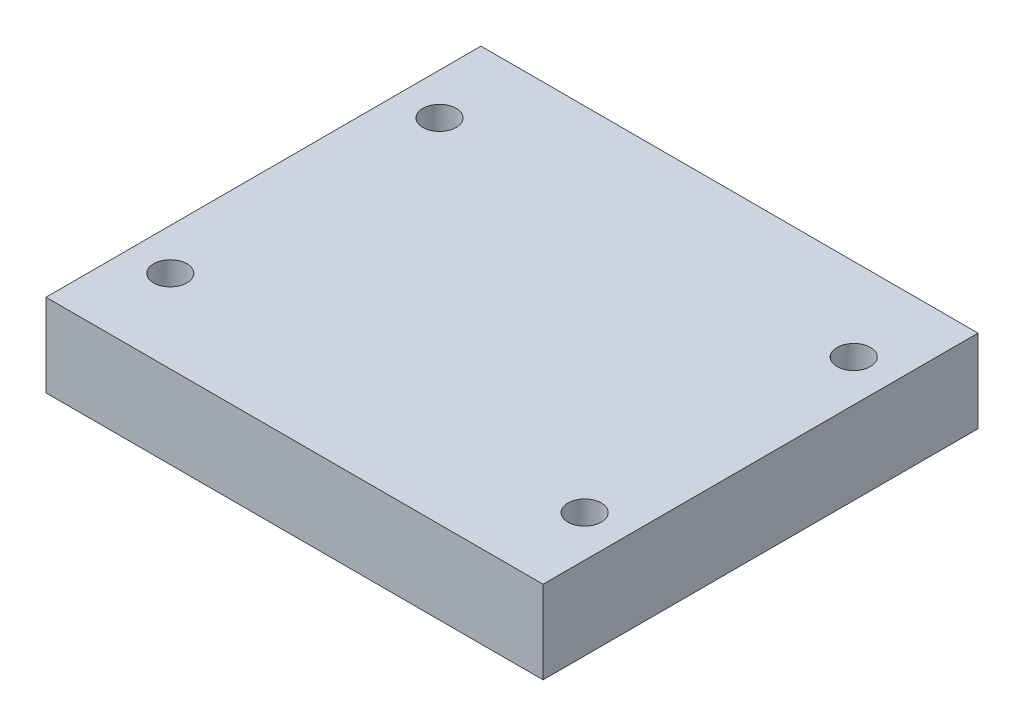
ISO-10303-21;
HEADER;
FILE_DESCRIPTION(('STEP AP214'),'2;1');
FILE_NAME('part.step','',(''),(''),'','','');
FILE_SCHEMA(('AUTOMOTIVE_DESIGN { 1 0 10303 214 1 1 1 1 }'));
ENDSEC;
DATA;
#1=APPLICATION_CONTEXT('core data for automotive mechanical design processes');
#2=APPLICATION_PROTOCOL_DEFINITION('international standard','automotive_design',2000,#1);
#3=PRODUCT_CONTEXT('',#1,'mechanical');
#4=PRODUCT('Part','Part','',(#3));
#5=PRODUCT_RELATED_PRODUCT_CATEGORY('part','',(#4));
#6=PRODUCT_DEFINITION_FORMATION('','',#4);
#7=PRODUCT_DEFINITION_CONTEXT('part definition',#1,'design');
#8=PRODUCT_DEFINITION('design','',#6,#7);
#9=PRODUCT_DEFINITION_SHAPE('','',#8);
#10=(LENGTH_UNIT() NAMED_UNIT(*) SI_UNIT(.MILLI.,.METRE.));
#11=(NAMED_UNIT(*) PLANE_ANGLE_UNIT() SI_UNIT($,.RADIAN.));
#12=(NAMED_UNIT(*) SI_UNIT($,.STERADIAN.) SOLID_ANGLE_UNIT());
#13=UNCERTAINTY_MEASURE_WITH_UNIT(LENGTH_MEASURE(1.E-05),#10,'distance_accuracy_value','');
#14=(GEOMETRIC_REPRESENTATION_CONTEXT(3) GLOBAL_UNCERTAINTY_ASSIGNED_CONTEXT((#13)) GLOBAL_UNIT_ASSIGNED_CONTEXT((#10,
#11,#12)) REPRESENTATION_CONTEXT('',''));
#15=CARTESIAN_POINT('',(0.,0.,0.));
#16=DIRECTION('',(0.,0.,1.));
#17=DIRECTION('',(1.,0.,0.));
#18=AXIS2_PLACEMENT_3D('',#15,#16,#17);
#19=CARTESIAN_POINT('',(0.,0.,0.));
#20=DIRECTION('',(0.,-1.,0.));
#21=DIRECTION('',(0.,0.,-1.));
#22=AXIS2_PLACEMENT_3D('',#19,#20,#21);
#23=PLANE('',#22);
#24=DIRECTION('',(0.,0.,1.));
#25=VECTOR('',#24,1.);
#26=CARTESIAN_POINT('',(-38.1,0.,33.3375));
#27=LINE('',#26,#25);
#28=CARTESIAN_POINT('',(-38.1,0.,-33.3375));
#29=VERTEX_POINT('',#28);
#30=CARTESIAN_POINT('',(-38.1,0.,33.3375));
#31=VERTEX_POINT('',#30);
#32=EDGE_CURVE('E97',#29,#31,#27,.T.);
#33=ORIENTED_EDGE('',*,*,#32,.F.);
#34=DIRECTION('',(-1.,0.,0.));
#35=VECTOR('',#34,1.);
#36=CARTESIAN_POINT('',(-38.1,0.,-33.3375));
#37=LINE('',#36,#35);
#38=CARTESIAN_POINT('',(38.1,0.,-33.3375));
#39=VERTEX_POINT('',#38);
#40=EDGE_CURVE('E73',#39,#29,#37,.T.);
#41=ORIENTED_EDGE('',*,*,#40,.F.);
#42=DIRECTION('',(0.,0.,-1.));
#43=VECTOR('',#42,1.);
#44=CARTESIAN_POINT('',(38.1,0.,33.3375));
#45=LINE('',#44,#43);
#46=CARTESIAN_POINT('',(38.1,0.,33.3375));
#47=VERTEX_POINT('',#46);
#48=EDGE_CURVE('E67',#47,#39,#45,.T.);
#49=ORIENTED_EDGE('',*,*,#48,.F.);
#50=DIRECTION('',(1.,0.,0.));
#51=VECTOR('',#50,1.);
#52=CARTESIAN_POINT('',(-38.1,0.,33.3375));
#53=LINE('',#52,#51);
#54=EDGE_CURVE('E89',#31,#47,#53,.T.);
#55=ORIENTED_EDGE('',*,*,#54,.F.);
#56=EDGE_LOOP('',(#33,#41,#49,#55));
#57=FACE_BOUND('',#56,.T.);
#58=CARTESIAN_POINT('',(31.7748107462907,0.,20.6375));
#59=DIRECTION('',(0.,1.,0.));
#60=DIRECTION('',(0.,0.,1.));
#61=AXIS2_PLACEMENT_3D('',#58,#59,#60);
#62=CIRCLE('',#61,2.5527);
#63=CARTESIAN_POINT('',(31.7748107462907,0.,23.1902));
#64=VERTEX_POINT('',#63);
#65=EDGE_CURVE('E100',#64,#64,#62,.T.);
#66=ORIENTED_EDGE('',*,*,#65,.T.);
#67=EDGE_LOOP('',(#66));
#68=FACE_BOUND('',#67,.T.);
#69=CARTESIAN_POINT('',(31.75,0.,-20.6375));
#70=DIRECTION('',(0.,1.,0.));
#71=DIRECTION('',(0.,0.,1.));
#72=AXIS2_PLACEMENT_3D('',#69,#70,#71);
#73=CIRCLE('',#72,2.5527);
#74=CARTESIAN_POINT('',(31.75,0.,-18.0848));
#75=VERTEX_POINT('',#74);
#76=EDGE_CURVE('E116',#75,#75,#73,.T.);
#77=ORIENTED_EDGE('',*,*,#76,.T.);
#78=EDGE_LOOP('',(#77));
#79=FACE_BOUND('',#78,.T.);
#80=CARTESIAN_POINT('',(-31.75,0.,20.6375));
#81=DIRECTION('',(0.,1.,0.));
#82=DIRECTION('',(0.,0.,1.));
#83=AXIS2_PLACEMENT_3D('',#80,#81,#82);
#84=CIRCLE('',#83,2.5527);
#85=CARTESIAN_POINT('',(-31.75,0.,23.1902));
#86=VERTEX_POINT('',#85);
#87=EDGE_CURVE('E122',#86,#86,#84,.T.);
#88=ORIENTED_EDGE('',*,*,#87,.T.);
#89=EDGE_LOOP('',(#88));
#90=FACE_BOUND('',#89,.T.);
#91=CARTESIAN_POINT('',(-31.75,0.,-20.6375));
#92=DIRECTION('',(0.,1.,0.));
#93=DIRECTION('',(0.,0.,1.));
#94=AXIS2_PLACEMENT_3D('',#91,#92,#93);
#95=CIRCLE('',#94,2.5527);
#96=CARTESIAN_POINT('',(-31.75,0.,-18.0848));
#97=VERTEX_POINT('',#96);
#98=EDGE_CURVE('E128',#97,#97,#95,.T.);
#99=ORIENTED_EDGE('',*,*,#98,.T.);
#100=EDGE_LOOP('',(#99));
#101=FACE_BOUND('',#100,.T.);
#102=ADVANCED_FACE('F33',(#57,#68,#79,#90,#101),#23,.T.);
#103=CARTESIAN_POINT('',(-38.1,12.7,33.3375));
#104=DIRECTION('',(1.,0.,0.));
#105=DIRECTION('',(0.,0.,-1.));
#106=AXIS2_PLACEMENT_3D('',#103,#104,#105);
#107=PLANE('',#106);
#108=ORIENTED_EDGE('',*,*,#32,.T.);
#109=DIRECTION('',(0.,-1.,0.));
#110=VECTOR('',#109,1.);
#111=CARTESIAN_POINT('',(-38.1,12.7,33.3375));
#112=LINE('',#111,#110);
#113=CARTESIAN_POINT('',(-38.1,12.7,33.3375));
#114=VERTEX_POINT('',#113);
#115=EDGE_CURVE('E11',#114,#31,#112,.T.);
#116=ORIENTED_EDGE('',*,*,#115,.F.);
#117=DIRECTION('',(0.,0.,1.));
#118=VECTOR('',#117,1.);
#119=CARTESIAN_POINT('',(-38.1,12.7,33.3375));
#120=LINE('',#119,#118);
#121=CARTESIAN_POINT('',(-38.1,12.7,-33.3375));
#122=VERTEX_POINT('',#121);
#123=EDGE_CURVE('E85',#122,#114,#120,.T.);
#124=ORIENTED_EDGE('',*,*,#123,.F.);
#125=DIRECTION('',(0.,-1.,0.));
#126=VECTOR('',#125,1.);
#127=CARTESIAN_POINT('',(-38.1,12.7,-33.3375));
#128=LINE('',#127,#126);
#129=EDGE_CURVE('E93',#122,#29,#128,.T.);
#130=ORIENTED_EDGE('',*,*,#129,.T.);
#131=EDGE_LOOP('',(#108,#116,#124,#130));
#132=FACE_BOUND('',#131,.T.);
#133=ADVANCED_FACE('F35',(#132),#107,.F.);
#134=CARTESIAN_POINT('',(-38.1,12.7,33.3375));
#135=DIRECTION('',(0.,0.,-1.));
#136=DIRECTION('',(-1.,0.,0.));
#137=AXIS2_PLACEMENT_3D('',#134,#135,#136);
#138=PLANE('',#137);
#139=ORIENTED_EDGE('',*,*,#54,.T.);
#140=DIRECTION('',(0.,-1.,0.));
#141=VECTOR('',#140,1.);
#142=CARTESIAN_POINT('',(38.1,12.7,33.3375));
#143=LINE('',#142,#141);
#144=CARTESIAN_POINT('',(38.1,12.7,33.3375));
#145=VERTEX_POINT('',#144);
#146=EDGE_CURVE('E42',#145,#47,#143,.T.);
#147=ORIENTED_EDGE('',*,*,#146,.F.);
#148=DIRECTION('',(1.,0.,0.));
#149=VECTOR('',#148,1.);
#150=CARTESIAN_POINT('',(-38.1,12.7,33.3375));
#151=LINE('',#150,#149);
#152=EDGE_CURVE('E80',#114,#145,#151,.T.);
#153=ORIENTED_EDGE('',*,*,#152,.F.);
#154=ORIENTED_EDGE('',*,*,#115,.T.);
#155=EDGE_LOOP('',(#139,#147,#153,#154));
#156=FACE_BOUND('',#155,.T.);
#157=ADVANCED_FACE('F88',(#156),#138,.F.);
#158=CARTESIAN_POINT('',(38.1,12.7,33.3375));
#159=DIRECTION('',(-1.,0.,0.));
#160=DIRECTION('',(0.,0.,1.));
#161=AXIS2_PLACEMENT_3D('',#158,#159,#160);
#162=PLANE('',#161);
#163=ORIENTED_EDGE('',*,*,#48,.T.);
#164=DIRECTION('',(0.,-1.,0.));
#165=VECTOR('',#164,1.);
#166=CARTESIAN_POINT('',(38.1,12.7,-33.3375));
#167=LINE('',#166,#165);
#168=CARTESIAN_POINT('',(38.1,12.7,-33.3375));
#169=VERTEX_POINT('',#168);
#170=EDGE_CURVE('E90',#169,#39,#167,.T.);
#171=ORIENTED_EDGE('',*,*,#170,.F.);
#172=DIRECTION('',(0.,0.,-1.));
#173=VECTOR('',#172,1.);
#174=CARTESIAN_POINT('',(38.1,12.7,33.3375));
#175=LINE('',#174,#173);
#176=EDGE_CURVE('E83',#145,#169,#175,.T.);
#177=ORIENTED_EDGE('',*,*,#176,.F.);
#178=ORIENTED_EDGE('',*,*,#146,.T.);
#179=EDGE_LOOP('',(#163,#171,#177,#178));
#180=FACE_BOUND('',#179,.T.);
#181=ADVANCED_FACE('F91',(#180),#162,.F.);
#182=CARTESIAN_POINT('',(-38.1,12.7,-33.3375));
#183=DIRECTION('',(0.,0.,1.));
#184=DIRECTION('',(1.,0.,0.));
#185=AXIS2_PLACEMENT_3D('',#182,#183,#184);
#186=PLANE('',#185);
#187=ORIENTED_EDGE('',*,*,#40,.T.);
#188=ORIENTED_EDGE('',*,*,#129,.F.);
#189=DIRECTION('',(-1.,0.,0.));
#190=VECTOR('',#189,1.);
#191=CARTESIAN_POINT('',(-38.1,12.7,-33.3375));
#192=LINE('',#191,#190);
#193=EDGE_CURVE('E50',#169,#122,#192,.T.);
#194=ORIENTED_EDGE('',*,*,#193,.F.);
#195=ORIENTED_EDGE('',*,*,#170,.T.);
#196=EDGE_LOOP('',(#187,#188,#194,#195));
#197=FACE_BOUND('',#196,.T.);
#198=ADVANCED_FACE('F105',(#197),#186,.F.);
#199=CARTESIAN_POINT('',(0.,12.7,0.));
#200=DIRECTION('',(0.,-1.,0.));
#201=DIRECTION('',(0.,0.,-1.));
#202=AXIS2_PLACEMENT_3D('',#199,#200,#201);
#203=PLANE('',#202);
#204=CARTESIAN_POINT('',(-31.75,12.7,-20.6375));
#205=DIRECTION('',(0.,1.,0.));
#206=DIRECTION('',(0.,0.,1.));
#207=AXIS2_PLACEMENT_3D('',#204,#205,#206);
#208=CIRCLE('',#207,2.5527);
#209=CARTESIAN_POINT('',(-31.75,12.7,-18.0848));
#210=VERTEX_POINT('',#209);
#211=EDGE_CURVE('E131',#210,#210,#208,.T.);
#212=ORIENTED_EDGE('',*,*,#211,.F.);
#213=EDGE_LOOP('',(#212));
#214=FACE_BOUND('',#213,.T.);
#215=CARTESIAN_POINT('',(-31.75,12.7,20.6375));
#216=DIRECTION('',(0.,1.,0.));
#217=DIRECTION('',(0.,0.,1.));
#218=AXIS2_PLACEMENT_3D('',#215,#216,#217);
#219=CIRCLE('',#218,2.5527);
#220=CARTESIAN_POINT('',(-31.75,12.7,23.1902));
#221=VERTEX_POINT('',#220);
#222=EDGE_CURVE('E125',#221,#221,#219,.T.);
#223=ORIENTED_EDGE('',*,*,#222,.F.);
#224=EDGE_LOOP('',(#223));
#225=FACE_BOUND('',#224,.T.);
#226=CARTESIAN_POINT('',(31.75,12.7,-20.6375));
#227=DIRECTION('',(0.,1.,0.));
#228=DIRECTION('',(0.,0.,1.));
#229=AXIS2_PLACEMENT_3D('',#226,#227,#228);
#230=CIRCLE('',#229,2.5527);
#231=CARTESIAN_POINT('',(31.75,12.7,-18.0848));
#232=VERTEX_POINT('',#231);
#233=EDGE_CURVE('E119',#232,#232,#230,.T.);
#234=ORIENTED_EDGE('',*,*,#233,.F.);
#235=EDGE_LOOP('',(#234));
#236=FACE_BOUND('',#235,.T.);
#237=CARTESIAN_POINT('',(31.7748107462907,12.7,20.6375));
#238=DIRECTION('',(0.,1.,0.));
#239=DIRECTION('',(0.,0.,1.));
#240=AXIS2_PLACEMENT_3D('',#237,#238,#239);
#241=CIRCLE('',#240,2.5527);
#242=CARTESIAN_POINT('',(31.7748107462907,12.7,23.1902));
#243=VERTEX_POINT('',#242);
#244=EDGE_CURVE('E113',#243,#243,#241,.T.);
#245=ORIENTED_EDGE('',*,*,#244,.F.);
#246=EDGE_LOOP('',(#245));
#247=FACE_BOUND('',#246,.T.);
#248=ORIENTED_EDGE('',*,*,#123,.T.);
#249=ORIENTED_EDGE('',*,*,#152,.T.);
#250=ORIENTED_EDGE('',*,*,#176,.T.);
#251=ORIENTED_EDGE('',*,*,#193,.T.);
#252=EDGE_LOOP('',(#248,#249,#250,#251));
#253=FACE_BOUND('',#252,.T.);
#254=ADVANCED_FACE('F81',(#214,#225,#236,#247,#253),#203,.F.);
#255=CARTESIAN_POINT('',(31.7748107462907,12.7,20.6375));
#256=DIRECTION('',(0.,1.,0.));
#257=DIRECTION('',(0.,0.,1.));
#258=AXIS2_PLACEMENT_3D('',#255,#256,#257);
#259=CYLINDRICAL_SURFACE('',#258,2.5527);
#260=ORIENTED_EDGE('',*,*,#65,.F.);
#261=EDGE_LOOP('',(#260));
#262=FACE_BOUND('',#261,.T.);
#263=ORIENTED_EDGE('',*,*,#244,.T.);
#264=EDGE_LOOP('',(#263));
#265=FACE_BOUND('',#264,.T.);
#266=ADVANCED_FACE('F139',(#262,#265),#259,.F.);
#267=CARTESIAN_POINT('',(31.75,12.7,-20.6375));
#268=DIRECTION('',(0.,1.,0.));
#269=DIRECTION('',(0.,0.,1.));
#270=AXIS2_PLACEMENT_3D('',#267,#268,#269);
#271=CYLINDRICAL_SURFACE('',#270,2.5527);
#272=ORIENTED_EDGE('',*,*,#76,.F.);
#273=EDGE_LOOP('',(#272));
#274=FACE_BOUND('',#273,.T.);
#275=ORIENTED_EDGE('',*,*,#233,.T.);
#276=EDGE_LOOP('',(#275));
#277=FACE_BOUND('',#276,.T.);
#278=ADVANCED_FACE('F148',(#274,#277),#271,.F.);
#279=CARTESIAN_POINT('',(-31.75,12.7,20.6375));
#280=DIRECTION('',(0.,1.,0.));
#281=DIRECTION('',(0.,0.,1.));
#282=AXIS2_PLACEMENT_3D('',#279,#280,#281);
#283=CYLINDRICAL_SURFACE('',#282,2.5527);
#284=ORIENTED_EDGE('',*,*,#87,.F.);
#285=EDGE_LOOP('',(#284));
#286=FACE_BOUND('',#285,.T.);
#287=ORIENTED_EDGE('',*,*,#222,.T.);
#288=EDGE_LOOP('',(#287));
#289=FACE_BOUND('',#288,.T.);
#290=ADVANCED_FACE('F155',(#286,#289),#283,.F.);
#291=CARTESIAN_POINT('',(-31.75,12.7,-20.6375));
#292=DIRECTION('',(0.,1.,0.));
#293=DIRECTION('',(0.,0.,1.));
#294=AXIS2_PLACEMENT_3D('',#291,#292,#293);
#295=CYLINDRICAL_SURFACE('',#294,2.5527);
#296=ORIENTED_EDGE('',*,*,#98,.F.);
#297=EDGE_LOOP('',(#296));
#298=FACE_BOUND('',#297,.T.);
#299=ORIENTED_EDGE('',*,*,#211,.T.);
#300=EDGE_LOOP('',(#299));
#301=FACE_BOUND('',#300,.T.);
#302=ADVANCED_FACE('F135',(#298,#301),#295,.F.);
#303=CLOSED_SHELL('',(#102,#133,#157,#181,#198,#254,#266,#278,#290,#302));
#304=MANIFOLD_SOLID_BREP('B2',#303);
#305=ADVANCED_BREP_SHAPE_REPRESENTATION('',(#18,#304),#14);
#306=SHAPE_DEFINITION_REPRESENTATION(#9,#305);
ENDSEC;
END-ISO-10303-21;
